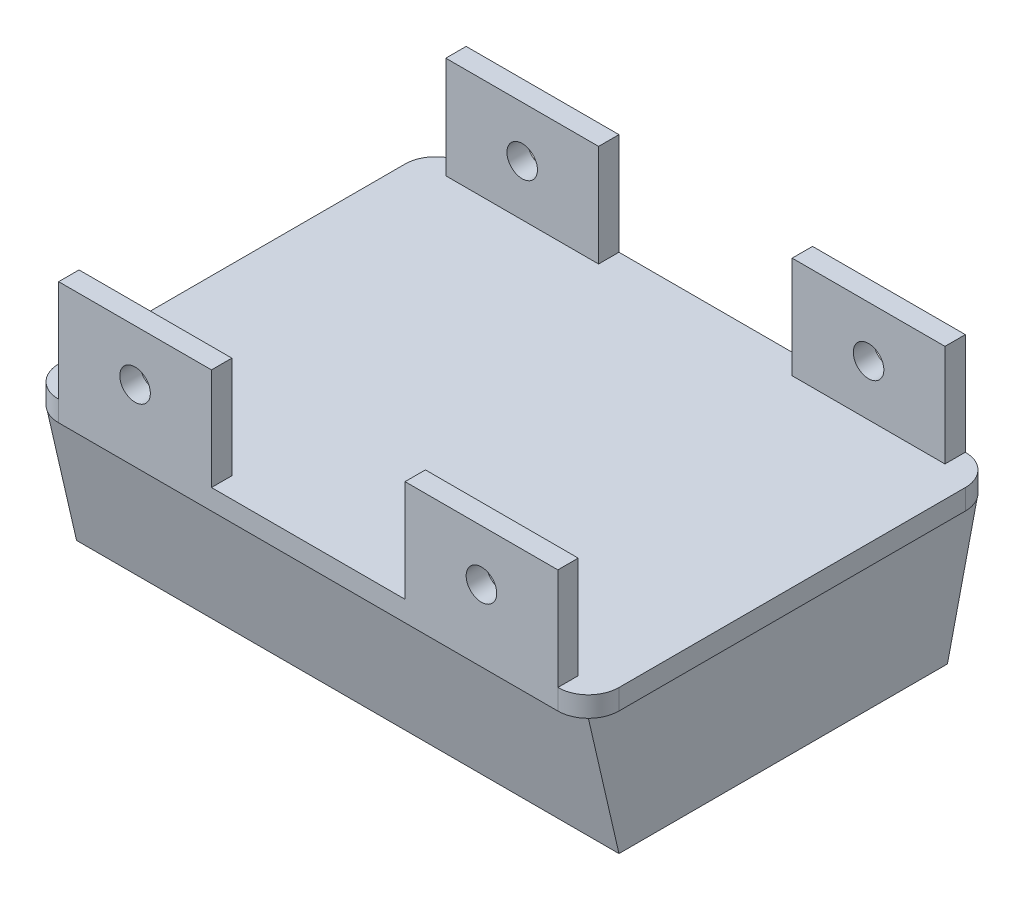
ISO-10303-21;
HEADER;
FILE_DESCRIPTION(('STEP AP214'),'2;1');
FILE_NAME('part.step','',(''),(''),'','','');
FILE_SCHEMA(('AUTOMOTIVE_DESIGN { 1 0 10303 214 1 1 1 1 }'));
ENDSEC;
DATA;
#1=APPLICATION_CONTEXT('core data for automotive mechanical design processes');
#2=APPLICATION_PROTOCOL_DEFINITION('international standard','automotive_design',2000,#1);
#3=PRODUCT_CONTEXT('',#1,'mechanical');
#4=PRODUCT('Part','Part','',(#3));
#5=PRODUCT_RELATED_PRODUCT_CATEGORY('part','',(#4));
#6=PRODUCT_DEFINITION_FORMATION('','',#4);
#7=PRODUCT_DEFINITION_CONTEXT('part definition',#1,'design');
#8=PRODUCT_DEFINITION('design','',#6,#7);
#9=PRODUCT_DEFINITION_SHAPE('','',#8);
#10=(LENGTH_UNIT() NAMED_UNIT(*) SI_UNIT(.MILLI.,.METRE.));
#11=(NAMED_UNIT(*) PLANE_ANGLE_UNIT() SI_UNIT($,.RADIAN.));
#12=(NAMED_UNIT(*) SI_UNIT($,.STERADIAN.) SOLID_ANGLE_UNIT());
#13=UNCERTAINTY_MEASURE_WITH_UNIT(LENGTH_MEASURE(1.E-05),#10,'distance_accuracy_value','');
#14=(GEOMETRIC_REPRESENTATION_CONTEXT(3) GLOBAL_UNCERTAINTY_ASSIGNED_CONTEXT((#13)) GLOBAL_UNIT_ASSIGNED_CONTEXT((#10,
#11,#12)) REPRESENTATION_CONTEXT('',''));
#15=CARTESIAN_POINT('',(0.,0.,0.));
#16=DIRECTION('',(0.,0.,1.));
#17=DIRECTION('',(1.,0.,0.));
#18=AXIS2_PLACEMENT_3D('',#15,#16,#17);
#19=CARTESIAN_POINT('',(8.81179653403585,-13.,22.752272724512));
#20=DIRECTION('',(1.,0.,0.));
#21=DIRECTION('',(0.,0.,-1.));
#22=AXIS2_PLACEMENT_3D('',#19,#20,#21);
#23=PLANE('',#22);
#24=DIRECTION('',(0.,-0.97439119569462,0.224859506698759));
#25=VECTOR('',#24,1.);
#26=CARTESIAN_POINT('',(8.81179653403585,-20.7217021730205,-10.7084366919102));
#27=LINE('',#26,#25);
#28=CARTESIAN_POINT('',(8.81179653403585,0.,-15.4903679626073));
#29=VERTEX_POINT('',#28);
#30=CARTESIAN_POINT('',(8.81179653403585,-13.,-12.4903679626073));
#31=VERTEX_POINT('',#30);
#32=EDGE_CURVE('E63',#29,#31,#27,.T.);
#33=ORIENTED_EDGE('',*,*,#32,.F.);
#34=DIRECTION('',(0.,0.,-1.));
#35=VECTOR('',#34,1.);
#36=CARTESIAN_POINT('',(8.81179653403585,0.,22.752272724512));
#37=LINE('',#36,#35);
#38=CARTESIAN_POINT('',(8.81179653403584,0.,22.752272724512));
#39=VERTEX_POINT('',#38);
#40=EDGE_CURVE('E238',#39,#29,#37,.T.);
#41=ORIENTED_EDGE('',*,*,#40,.F.);
#42=DIRECTION('',(0.,-0.97439119569462,-0.224859506698759));
#43=VECTOR('',#42,1.);
#44=CARTESIAN_POINT('',(8.81179653403585,-12.3426966292135,19.9039581177705));
#45=LINE('',#44,#43);
#46=CARTESIAN_POINT('',(8.81179653403585,-13.,19.752272724512));
#47=VERTEX_POINT('',#46);
#48=EDGE_CURVE('E219',#39,#47,#45,.T.);
#49=ORIENTED_EDGE('',*,*,#48,.T.);
#50=DIRECTION('',(0.,0.,-1.));
#51=VECTOR('',#50,1.);
#52=CARTESIAN_POINT('',(8.81179653403585,-13.,22.752272724512));
#53=LINE('',#52,#51);
#54=EDGE_CURVE('E227',#47,#31,#53,.T.);
#55=ORIENTED_EDGE('',*,*,#54,.T.);
#56=EDGE_LOOP('',(#33,#41,#49,#55));
#57=FACE_BOUND('',#56,.T.);
#58=ADVANCED_FACE('F40',(#57),#23,.T.);
#59=CARTESIAN_POINT('',(-44.4308441530834,-13.,22.752272724512));
#60=DIRECTION('',(1.,0.,0.));
#61=DIRECTION('',(0.,0.,-1.));
#62=AXIS2_PLACEMENT_3D('',#59,#60,#61);
#63=PLANE('',#62);
#64=DIRECTION('',(0.,0.,-1.));
#65=VECTOR('',#64,1.);
#66=CARTESIAN_POINT('',(-44.4308441530834,0.,22.752272724512));
#67=LINE('',#66,#65);
#68=CARTESIAN_POINT('',(-44.4308441530834,0.,22.752272724512));
#69=VERTEX_POINT('',#68);
#70=CARTESIAN_POINT('',(-44.4308441530834,0.,-15.4903679626073));
#71=VERTEX_POINT('',#70);
#72=EDGE_CURVE('E222',#69,#71,#67,.T.);
#73=ORIENTED_EDGE('',*,*,#72,.T.);
#74=DIRECTION('',(0.,0.97439119569462,-0.224859506698759));
#75=VECTOR('',#74,1.);
#76=CARTESIAN_POINT('',(-44.4308441530834,-13.,-12.4903679626073));
#77=LINE('',#76,#75);
#78=CARTESIAN_POINT('',(-44.4308441530834,-13.,-12.4903679626073));
#79=VERTEX_POINT('',#78);
#80=EDGE_CURVE('E211',#79,#71,#77,.T.);
#81=ORIENTED_EDGE('',*,*,#80,.F.);
#82=DIRECTION('',(0.,0.,-1.));
#83=VECTOR('',#82,1.);
#84=CARTESIAN_POINT('',(-44.4308441530834,-13.,22.752272724512));
#85=LINE('',#84,#83);
#86=CARTESIAN_POINT('',(-44.4308441530834,-13.,19.752272724512));
#87=VERTEX_POINT('',#86);
#88=EDGE_CURVE('E308',#87,#79,#85,.T.);
#89=ORIENTED_EDGE('',*,*,#88,.F.);
#90=DIRECTION('',(0.,0.97439119569462,0.224859506698759));
#91=VECTOR('',#90,1.);
#92=CARTESIAN_POINT('',(-44.4308441530834,-13.,19.752272724512));
#93=LINE('',#92,#91);
#94=EDGE_CURVE('E55',#87,#69,#93,.T.);
#95=ORIENTED_EDGE('',*,*,#94,.T.);
#96=EDGE_LOOP('',(#73,#81,#89,#95));
#97=FACE_BOUND('',#96,.T.);
#98=ADVANCED_FACE('F223',(#97),#63,.F.);
#99=CARTESIAN_POINT('',(0.,-13.,0.));
#100=DIRECTION('',(0.,1.,0.));
#101=DIRECTION('',(0.,0.,1.));
#102=AXIS2_PLACEMENT_3D('',#99,#100,#101);
#103=PLANE('',#102);
#104=CARTESIAN_POINT('',(-17.8095238095238,-13.,3.63095238095238));
#105=DIRECTION('',(0.,1.,0.));
#106=DIRECTION('',(0.,0.,1.));
#107=AXIS2_PLACEMENT_3D('',#104,#105,#106);
#108=CIRCLE('',#107,0.750000000000002);
#109=CARTESIAN_POINT('',(-17.8095238095238,-13.,4.38095238095238));
#110=VERTEX_POINT('',#109);
#111=EDGE_CURVE('E11',#110,#110,#108,.F.);
#112=ORIENTED_EDGE('',*,*,#111,.F.);
#113=EDGE_LOOP('',(#112));
#114=FACE_BOUND('',#113,.T.);
#115=ORIENTED_EDGE('',*,*,#88,.T.);
#116=DIRECTION('',(1.,0.,0.));
#117=VECTOR('',#116,1.);
#118=CARTESIAN_POINT('',(0.,-13.,-12.4903679626073));
#119=LINE('',#118,#117);
#120=EDGE_CURVE('E48',#79,#31,#119,.T.);
#121=ORIENTED_EDGE('',*,*,#120,.T.);
#122=ORIENTED_EDGE('',*,*,#54,.F.);
#123=DIRECTION('',(1.,0.,0.));
#124=VECTOR('',#123,1.);
#125=CARTESIAN_POINT('',(0.,-13.,19.752272724512));
#126=LINE('',#125,#124);
#127=EDGE_CURVE('E293',#87,#47,#126,.T.);
#128=ORIENTED_EDGE('',*,*,#127,.F.);
#129=EDGE_LOOP('',(#115,#121,#122,#128));
#130=FACE_BOUND('',#129,.T.);
#131=ADVANCED_FACE('F307',(#114,#130),#103,.F.);
#132=CARTESIAN_POINT('',(0.,0.,0.));
#133=DIRECTION('',(0.,1.,0.));
#134=DIRECTION('',(0.,0.,1.));
#135=AXIS2_PLACEMENT_3D('',#132,#133,#134);
#136=PLANE('',#135);
#137=DIRECTION('',(1.,0.,0.));
#138=VECTOR('',#137,1.);
#139=CARTESIAN_POINT('',(-44.4308441530834,0.,-15.4903679626073));
#140=LINE('',#139,#138);
#141=EDGE_CURVE('E215',#71,#29,#140,.T.);
#142=ORIENTED_EDGE('',*,*,#141,.F.);
#143=CARTESIAN_POINT('',(-42.3095238095238,0.,-13.3690476190476));
#144=DIRECTION('',(0.,1.,0.));
#145=DIRECTION('',(0.,0.,1.));
#146=AXIS2_PLACEMENT_3D('',#143,#144,#145);
#147=CIRCLE('',#146,3.);
#148=CARTESIAN_POINT('',(-42.3095238095238,0.,-16.3690476190476));
#149=VERTEX_POINT('',#148);
#150=EDGE_CURVE('E235',#71,#149,#147,.F.);
#151=ORIENTED_EDGE('',*,*,#150,.T.);
#152=DIRECTION('',(-1.,0.,0.));
#153=VECTOR('',#152,1.);
#154=CARTESIAN_POINT('',(-45.3095238095238,0.,-16.3690476190476));
#155=LINE('',#154,#153);
#156=CARTESIAN_POINT('',(6.6904761904762,0.,-16.3690476190476));
#157=VERTEX_POINT('',#156);
#158=EDGE_CURVE('E457',#157,#149,#155,.T.);
#159=ORIENTED_EDGE('',*,*,#158,.F.);
#160=CARTESIAN_POINT('',(6.6904761904762,0.,-13.3690476190476));
#161=DIRECTION('',(0.,1.,0.));
#162=DIRECTION('',(0.,0.,1.));
#163=AXIS2_PLACEMENT_3D('',#160,#161,#162);
#164=CIRCLE('',#163,3.);
#165=EDGE_CURVE('E237',#157,#29,#164,.F.);
#166=ORIENTED_EDGE('',*,*,#165,.T.);
#167=EDGE_LOOP('',(#142,#151,#159,#166));
#168=FACE_BOUND('',#167,.T.);
#169=ADVANCED_FACE('F233',(#168),#136,.F.);
#170=ORIENTED_EDGE('',*,*,#72,.F.);
#171=CARTESIAN_POINT('',(-42.3095238095238,0.,20.6309523809524));
#172=DIRECTION('',(0.,1.,0.));
#173=DIRECTION('',(0.,0.,1.));
#174=AXIS2_PLACEMENT_3D('',#171,#172,#173);
#175=CIRCLE('',#174,3.);
#176=CARTESIAN_POINT('',(-45.3095238095238,0.,20.6309523809524));
#177=VERTEX_POINT('',#176);
#178=EDGE_CURVE('E265',#69,#177,#175,.F.);
#179=ORIENTED_EDGE('',*,*,#178,.T.);
#180=DIRECTION('',(0.,0.,1.));
#181=VECTOR('',#180,1.);
#182=CARTESIAN_POINT('',(-45.3095238095238,0.,-16.3690476190476));
#183=LINE('',#182,#181);
#184=CARTESIAN_POINT('',(-45.3095238095238,0.,-13.3690476190476));
#185=VERTEX_POINT('',#184);
#186=EDGE_CURVE('E253',#185,#177,#183,.T.);
#187=ORIENTED_EDGE('',*,*,#186,.F.);
#188=EDGE_CURVE('E244',#185,#71,#147,.F.);
#189=ORIENTED_EDGE('',*,*,#188,.T.);
#190=EDGE_LOOP('',(#170,#179,#187,#189));
#191=FACE_BOUND('',#190,.T.);
#192=ADVANCED_FACE('F251',(#191),#136,.F.);
#193=CARTESIAN_POINT('',(-42.3095238095238,0.,23.6309523809524));
#194=VERTEX_POINT('',#193);
#195=EDGE_CURVE('E266',#194,#69,#175,.F.);
#196=ORIENTED_EDGE('',*,*,#195,.T.);
#197=DIRECTION('',(1.,0.,0.));
#198=VECTOR('',#197,1.);
#199=CARTESIAN_POINT('',(-44.4308441530834,0.,22.752272724512));
#200=LINE('',#199,#198);
#201=EDGE_CURVE('E228',#69,#39,#200,.T.);
#202=ORIENTED_EDGE('',*,*,#201,.T.);
#203=CARTESIAN_POINT('',(6.6904761904762,0.,20.6309523809524));
#204=DIRECTION('',(0.,1.,0.));
#205=DIRECTION('',(0.,0.,1.));
#206=AXIS2_PLACEMENT_3D('',#203,#204,#205);
#207=CIRCLE('',#206,3.);
#208=CARTESIAN_POINT('',(6.69047619047621,0.,23.6309523809524));
#209=VERTEX_POINT('',#208);
#210=EDGE_CURVE('E287',#39,#209,#207,.F.);
#211=ORIENTED_EDGE('',*,*,#210,.T.);
#212=DIRECTION('',(1.,0.,0.));
#213=VECTOR('',#212,1.);
#214=CARTESIAN_POINT('',(-45.3095238095238,0.,23.6309523809524));
#215=LINE('',#214,#213);
#216=EDGE_CURVE('E464',#194,#209,#215,.T.);
#217=ORIENTED_EDGE('',*,*,#216,.F.);
#218=EDGE_LOOP('',(#196,#202,#211,#217));
#219=FACE_BOUND('',#218,.T.);
#220=ADVANCED_FACE('F526',(#219),#136,.F.);
#221=CARTESIAN_POINT('',(6.6904761904762,2.,20.6309523809524));
#222=DIRECTION('',(0.,1.,0.));
#223=DIRECTION('',(0.,0.,1.));
#224=AXIS2_PLACEMENT_3D('',#221,#222,#223);
#225=CYLINDRICAL_SURFACE('',#224,3.);
#226=DIRECTION('',(0.,1.,0.));
#227=VECTOR('',#226,1.);
#228=CARTESIAN_POINT('',(6.6904761904762,2.,23.6309523809524));
#229=LINE('',#228,#227);
#230=CARTESIAN_POINT('',(6.6904761904762,2.,23.6309523809524));
#231=VERTEX_POINT('',#230);
#232=EDGE_CURVE('E281',#209,#231,#229,.T.);
#233=ORIENTED_EDGE('',*,*,#232,.F.);
#234=ORIENTED_EDGE('',*,*,#210,.F.);
#235=CARTESIAN_POINT('',(9.69047619047621,0.,20.6309523809524));
#236=VERTEX_POINT('',#235);
#237=EDGE_CURVE('E288',#236,#39,#207,.F.);
#238=ORIENTED_EDGE('',*,*,#237,.F.);
#239=DIRECTION('',(0.,1.,0.));
#240=VECTOR('',#239,1.);
#241=CARTESIAN_POINT('',(9.69047619047621,2.,20.6309523809524));
#242=LINE('',#241,#240);
#243=CARTESIAN_POINT('',(9.69047619047621,2.,20.6309523809524));
#244=VERTEX_POINT('',#243);
#245=EDGE_CURVE('E284',#244,#236,#242,.F.);
#246=ORIENTED_EDGE('',*,*,#245,.F.);
#247=CARTESIAN_POINT('',(6.6904761904762,2.,20.6309523809524));
#248=DIRECTION('',(0.,1.,0.));
#249=DIRECTION('',(0.,0.,1.));
#250=AXIS2_PLACEMENT_3D('',#247,#248,#249);
#251=CIRCLE('',#250,3.);
#252=EDGE_CURVE('E291',#231,#244,#251,.T.);
#253=ORIENTED_EDGE('',*,*,#252,.F.);
#254=EDGE_LOOP('',(#233,#234,#238,#246,#253));
#255=FACE_BOUND('',#254,.T.);
#256=ADVANCED_FACE('F42',(#255),#225,.T.);
#257=CARTESIAN_POINT('',(6.6904761904762,2.,-13.3690476190476));
#258=DIRECTION('',(0.,-1.,0.));
#259=DIRECTION('',(0.,0.,-1.));
#260=AXIS2_PLACEMENT_3D('',#257,#258,#259);
#261=CYLINDRICAL_SURFACE('',#260,3.);
#262=DIRECTION('',(0.,-1.,0.));
#263=VECTOR('',#262,1.);
#264=CARTESIAN_POINT('',(6.6904761904762,2.,-16.3690476190476));
#265=LINE('',#264,#263);
#266=CARTESIAN_POINT('',(6.6904761904762,2.,-16.3690476190476));
#267=VERTEX_POINT('',#266);
#268=EDGE_CURVE('E271',#267,#157,#265,.T.);
#269=ORIENTED_EDGE('',*,*,#268,.F.);
#270=CARTESIAN_POINT('',(6.6904761904762,2.,-13.3690476190476));
#271=DIRECTION('',(0.,1.,0.));
#272=DIRECTION('',(0.,0.,1.));
#273=AXIS2_PLACEMENT_3D('',#270,#271,#272);
#274=CIRCLE('',#273,3.);
#275=CARTESIAN_POINT('',(9.6904761904762,2.,-13.3690476190476));
#276=VERTEX_POINT('',#275);
#277=EDGE_CURVE('E277',#276,#267,#274,.T.);
#278=ORIENTED_EDGE('',*,*,#277,.F.);
#279=DIRECTION('',(0.,-1.,0.));
#280=VECTOR('',#279,1.);
#281=CARTESIAN_POINT('',(9.6904761904762,2.,-13.3690476190476));
#282=LINE('',#281,#280);
#283=CARTESIAN_POINT('',(9.6904761904762,0.,-13.3690476190476));
#284=VERTEX_POINT('',#283);
#285=EDGE_CURVE('E274',#284,#276,#282,.F.);
#286=ORIENTED_EDGE('',*,*,#285,.F.);
#287=EDGE_CURVE('E279',#29,#284,#164,.F.);
#288=ORIENTED_EDGE('',*,*,#287,.F.);
#289=ORIENTED_EDGE('',*,*,#165,.F.);
#290=EDGE_LOOP('',(#269,#278,#286,#288,#289));
#291=FACE_BOUND('',#290,.T.);
#292=ADVANCED_FACE('F511',(#291),#261,.T.);
#293=CARTESIAN_POINT('',(-42.3095238095238,2.,20.6309523809524));
#294=DIRECTION('',(0.,1.,0.));
#295=DIRECTION('',(0.,0.,1.));
#296=AXIS2_PLACEMENT_3D('',#293,#294,#295);
#297=CYLINDRICAL_SURFACE('',#296,3.);
#298=DIRECTION('',(0.,1.,0.));
#299=VECTOR('',#298,1.);
#300=CARTESIAN_POINT('',(-45.3095238095238,2.,20.6309523809524));
#301=LINE('',#300,#299);
#302=CARTESIAN_POINT('',(-45.3095238095238,2.,20.6309523809524));
#303=VERTEX_POINT('',#302);
#304=EDGE_CURVE('E255',#177,#303,#301,.T.);
#305=ORIENTED_EDGE('',*,*,#304,.F.);
#306=ORIENTED_EDGE('',*,*,#178,.F.);
#307=ORIENTED_EDGE('',*,*,#195,.F.);
#308=DIRECTION('',(0.,1.,0.));
#309=VECTOR('',#308,1.);
#310=CARTESIAN_POINT('',(-42.3095238095238,2.,23.6309523809524));
#311=LINE('',#310,#309);
#312=CARTESIAN_POINT('',(-42.3095238095238,2.,23.6309523809524));
#313=VERTEX_POINT('',#312);
#314=EDGE_CURVE('E262',#313,#194,#311,.F.);
#315=ORIENTED_EDGE('',*,*,#314,.F.);
#316=CARTESIAN_POINT('',(-42.3095238095238,2.,20.6309523809524));
#317=DIRECTION('',(0.,1.,0.));
#318=DIRECTION('',(0.,0.,1.));
#319=AXIS2_PLACEMENT_3D('',#316,#317,#318);
#320=CIRCLE('',#319,3.);
#321=EDGE_CURVE('E269',#303,#313,#320,.T.);
#322=ORIENTED_EDGE('',*,*,#321,.F.);
#323=EDGE_LOOP('',(#305,#306,#307,#315,#322));
#324=FACE_BOUND('',#323,.T.);
#325=ADVANCED_FACE('F634',(#324),#297,.T.);
#326=CARTESIAN_POINT('',(-42.3095238095238,2.,-13.3690476190476));
#327=DIRECTION('',(0.,1.,0.));
#328=DIRECTION('',(0.,0.,1.));
#329=AXIS2_PLACEMENT_3D('',#326,#327,#328);
#330=CYLINDRICAL_SURFACE('',#329,3.);
#331=DIRECTION('',(0.,1.,0.));
#332=VECTOR('',#331,1.);
#333=CARTESIAN_POINT('',(-42.3095238095238,2.,-16.3690476190476));
#334=LINE('',#333,#332);
#335=CARTESIAN_POINT('',(-42.3095238095238,2.,-16.3690476190476));
#336=VERTEX_POINT('',#335);
#337=EDGE_CURVE('E247',#149,#336,#334,.T.);
#338=ORIENTED_EDGE('',*,*,#337,.F.);
#339=ORIENTED_EDGE('',*,*,#150,.F.);
#340=ORIENTED_EDGE('',*,*,#188,.F.);
#341=DIRECTION('',(0.,1.,0.));
#342=VECTOR('',#341,1.);
#343=CARTESIAN_POINT('',(-45.3095238095238,2.,-13.3690476190476));
#344=LINE('',#343,#342);
#345=CARTESIAN_POINT('',(-45.3095238095238,2.,-13.3690476190476));
#346=VERTEX_POINT('',#345);
#347=EDGE_CURVE('E248',#346,#185,#344,.F.);
#348=ORIENTED_EDGE('',*,*,#347,.F.);
#349=CARTESIAN_POINT('',(-42.3095238095238,2.,-13.3690476190476));
#350=DIRECTION('',(0.,1.,0.));
#351=DIRECTION('',(0.,0.,1.));
#352=AXIS2_PLACEMENT_3D('',#349,#350,#351);
#353=CIRCLE('',#352,3.);
#354=EDGE_CURVE('E254',#336,#346,#353,.T.);
#355=ORIENTED_EDGE('',*,*,#354,.F.);
#356=EDGE_LOOP('',(#338,#339,#340,#348,#355));
#357=FACE_BOUND('',#356,.T.);
#358=ADVANCED_FACE('F242',(#357),#330,.T.);
#359=CARTESIAN_POINT('',(0.,2.,0.));
#360=DIRECTION('',(0.,1.,0.));
#361=DIRECTION('',(0.,0.,1.));
#362=AXIS2_PLACEMENT_3D('',#359,#360,#361);
#363=PLANE('',#362);
#364=DIRECTION('',(0.,0.,-1.));
#365=VECTOR('',#364,1.);
#366=CARTESIAN_POINT('',(6.6904761904762,2.,0.));
#367=LINE('',#366,#365);
#368=CARTESIAN_POINT('',(6.6904761904762,2.,21.6309523809524));
#369=VERTEX_POINT('',#368);
#370=EDGE_CURVE('E364',#231,#369,#367,.T.);
#371=ORIENTED_EDGE('',*,*,#370,.F.);
#372=ORIENTED_EDGE('',*,*,#252,.T.);
#373=DIRECTION('',(0.,0.,-1.));
#374=VECTOR('',#373,1.);
#375=CARTESIAN_POINT('',(9.6904761904762,2.,-16.3690476190476));
#376=LINE('',#375,#374);
#377=EDGE_CURVE('E459',#244,#276,#376,.T.);
#378=ORIENTED_EDGE('',*,*,#377,.T.);
#379=ORIENTED_EDGE('',*,*,#277,.T.);
#380=DIRECTION('',(0.,0.,1.));
#381=VECTOR('',#380,1.);
#382=CARTESIAN_POINT('',(6.6904761904762,2.,0.));
#383=LINE('',#382,#381);
#384=CARTESIAN_POINT('',(6.6904761904762,2.,-14.3690476190476));
#385=VERTEX_POINT('',#384);
#386=EDGE_CURVE('E335',#267,#385,#383,.T.);
#387=ORIENTED_EDGE('',*,*,#386,.T.);
#388=DIRECTION('',(-1.,0.,0.));
#389=VECTOR('',#388,1.);
#390=CARTESIAN_POINT('',(0.,2.,-14.3690476190476));
#391=LINE('',#390,#389);
#392=CARTESIAN_POINT('',(-8.30952380952379,2.,-14.3690476190476));
#393=VERTEX_POINT('',#392);
#394=EDGE_CURVE('E340',#385,#393,#391,.T.);
#395=ORIENTED_EDGE('',*,*,#394,.T.);
#396=DIRECTION('',(0.,0.,1.));
#397=VECTOR('',#396,1.);
#398=CARTESIAN_POINT('',(-8.30952380952379,2.,0.));
#399=LINE('',#398,#397);
#400=CARTESIAN_POINT('',(-8.30952380952379,2.,-16.3690476190476));
#401=VERTEX_POINT('',#400);
#402=EDGE_CURVE('E349',#401,#393,#399,.T.);
#403=ORIENTED_EDGE('',*,*,#402,.F.);
#404=DIRECTION('',(-1.,0.,0.));
#405=VECTOR('',#404,1.);
#406=CARTESIAN_POINT('',(-45.3095238095238,2.,-16.3690476190476));
#407=LINE('',#406,#405);
#408=CARTESIAN_POINT('',(-27.3095238095238,2.,-16.3690476190476));
#409=VERTEX_POINT('',#408);
#410=EDGE_CURVE('E461',#401,#409,#407,.T.);
#411=ORIENTED_EDGE('',*,*,#410,.T.);
#412=DIRECTION('',(0.,0.,1.));
#413=VECTOR('',#412,1.);
#414=CARTESIAN_POINT('',(-27.3095238095238,2.,0.));
#415=LINE('',#414,#413);
#416=CARTESIAN_POINT('',(-27.3095238095238,2.,-14.3690476190476));
#417=VERTEX_POINT('',#416);
#418=EDGE_CURVE('E424',#409,#417,#415,.T.);
#419=ORIENTED_EDGE('',*,*,#418,.T.);
#420=DIRECTION('',(1.,0.,0.));
#421=VECTOR('',#420,1.);
#422=CARTESIAN_POINT('',(0.,2.,-14.3690476190476));
#423=LINE('',#422,#421);
#424=CARTESIAN_POINT('',(-42.3095238095238,2.,-14.3690476190476));
#425=VERTEX_POINT('',#424);
#426=EDGE_CURVE('E429',#425,#417,#423,.T.);
#427=ORIENTED_EDGE('',*,*,#426,.F.);
#428=DIRECTION('',(0.,0.,1.));
#429=VECTOR('',#428,1.);
#430=CARTESIAN_POINT('',(-42.3095238095238,2.,0.));
#431=LINE('',#430,#429);
#432=EDGE_CURVE('E437',#336,#425,#431,.T.);
#433=ORIENTED_EDGE('',*,*,#432,.F.);
#434=ORIENTED_EDGE('',*,*,#354,.T.);
#435=DIRECTION('',(0.,0.,1.));
#436=VECTOR('',#435,1.);
#437=CARTESIAN_POINT('',(-45.3095238095238,2.,-16.3690476190476));
#438=LINE('',#437,#436);
#439=EDGE_CURVE('E453',#346,#303,#438,.T.);
#440=ORIENTED_EDGE('',*,*,#439,.T.);
#441=ORIENTED_EDGE('',*,*,#321,.T.);
#442=DIRECTION('',(0.,0.,1.));
#443=VECTOR('',#442,1.);
#444=CARTESIAN_POINT('',(-42.3095238095238,2.,0.));
#445=LINE('',#444,#443);
#446=CARTESIAN_POINT('',(-42.3095238095238,2.,21.6309523809524));
#447=VERTEX_POINT('',#446);
#448=EDGE_CURVE('E399',#447,#313,#445,.T.);
#449=ORIENTED_EDGE('',*,*,#448,.F.);
#450=DIRECTION('',(1.,0.,0.));
#451=VECTOR('',#450,1.);
#452=CARTESIAN_POINT('',(0.,2.,21.6309523809524));
#453=LINE('',#452,#451);
#454=CARTESIAN_POINT('',(-27.3095238095238,2.,21.6309523809524));
#455=VERTEX_POINT('',#454);
#456=EDGE_CURVE('E409',#447,#455,#453,.T.);
#457=ORIENTED_EDGE('',*,*,#456,.T.);
#458=DIRECTION('',(0.,0.,-1.));
#459=VECTOR('',#458,1.);
#460=CARTESIAN_POINT('',(-27.3095238095238,2.,0.));
#461=LINE('',#460,#459);
#462=CARTESIAN_POINT('',(-27.3095238095238,2.,23.6309523809524));
#463=VERTEX_POINT('',#462);
#464=EDGE_CURVE('E394',#463,#455,#461,.T.);
#465=ORIENTED_EDGE('',*,*,#464,.F.);
#466=DIRECTION('',(1.,0.,0.));
#467=VECTOR('',#466,1.);
#468=CARTESIAN_POINT('',(-45.3095238095238,2.,23.6309523809524));
#469=LINE('',#468,#467);
#470=CARTESIAN_POINT('',(-8.30952380952379,2.,23.6309523809524));
#471=VERTEX_POINT('',#470);
#472=EDGE_CURVE('E456',#463,#471,#469,.T.);
#473=ORIENTED_EDGE('',*,*,#472,.T.);
#474=DIRECTION('',(0.,0.,-1.));
#475=VECTOR('',#474,1.);
#476=CARTESIAN_POINT('',(-8.30952380952379,2.,0.));
#477=LINE('',#476,#475);
#478=CARTESIAN_POINT('',(-8.30952380952379,2.,21.6309523809524));
#479=VERTEX_POINT('',#478);
#480=EDGE_CURVE('E369',#471,#479,#477,.T.);
#481=ORIENTED_EDGE('',*,*,#480,.T.);
#482=DIRECTION('',(-1.,0.,0.));
#483=VECTOR('',#482,1.);
#484=CARTESIAN_POINT('',(0.,2.,21.6309523809524));
#485=LINE('',#484,#483);
#486=EDGE_CURVE('E379',#369,#479,#485,.T.);
#487=ORIENTED_EDGE('',*,*,#486,.F.);
#488=EDGE_LOOP('',(#371,#372,#378,#379,#387,#395,#403,#411,#419,#427,#433,#434,#440,#441,#449,
#457,#465,#473,#481,#487));
#489=FACE_BOUND('',#488,.T.);
#490=ADVANCED_FACE('F478',(#489),#363,.T.);
#491=CARTESIAN_POINT('',(-45.3095238095238,2.,-16.3690476190476));
#492=DIRECTION('',(1.,0.,0.));
#493=DIRECTION('',(0.,0.,-1.));
#494=AXIS2_PLACEMENT_3D('',#491,#492,#493);
#495=PLANE('',#494);
#496=ORIENTED_EDGE('',*,*,#186,.T.);
#497=ORIENTED_EDGE('',*,*,#304,.T.);
#498=ORIENTED_EDGE('',*,*,#439,.F.);
#499=ORIENTED_EDGE('',*,*,#347,.T.);
#500=EDGE_LOOP('',(#496,#497,#498,#499));
#501=FACE_BOUND('',#500,.T.);
#502=ADVANCED_FACE('F475',(#501),#495,.F.);
#503=CARTESIAN_POINT('',(-45.3095238095238,2.,23.6309523809524));
#504=DIRECTION('',(0.,0.,-1.));
#505=DIRECTION('',(-1.,0.,0.));
#506=AXIS2_PLACEMENT_3D('',#503,#504,#505);
#507=PLANE('',#506);
#508=CARTESIAN_POINT('',(-0.809523809523798,7.,23.6309523809524));
#509=DIRECTION('',(0.,0.,1.));
#510=DIRECTION('',(1.,0.,0.));
#511=AXIS2_PLACEMENT_3D('',#508,#509,#510);
#512=CIRCLE('',#511,1.5);
#513=CARTESIAN_POINT('',(0.690476190476202,7.,23.6309523809524));
#514=VERTEX_POINT('',#513);
#515=EDGE_CURVE('E298',#514,#514,#512,.T.);
#516=ORIENTED_EDGE('',*,*,#515,.F.);
#517=EDGE_LOOP('',(#516));
#518=FACE_BOUND('',#517,.T.);
#519=CARTESIAN_POINT('',(-34.8095238095238,7.,23.6309523809524));
#520=DIRECTION('',(0.,0.,1.));
#521=DIRECTION('',(1.,0.,0.));
#522=AXIS2_PLACEMENT_3D('',#519,#520,#521);
#523=CIRCLE('',#522,1.5);
#524=CARTESIAN_POINT('',(-33.3095238095238,7.,23.6309523809524));
#525=VERTEX_POINT('',#524);
#526=EDGE_CURVE('E314',#525,#525,#523,.T.);
#527=ORIENTED_EDGE('',*,*,#526,.F.);
#528=EDGE_LOOP('',(#527));
#529=FACE_BOUND('',#528,.T.);
#530=ORIENTED_EDGE('',*,*,#216,.T.);
#531=ORIENTED_EDGE('',*,*,#232,.T.);
#532=DIRECTION('',(0.,-1.,0.));
#533=VECTOR('',#532,1.);
#534=CARTESIAN_POINT('',(6.6904761904762,12.,23.6309523809524));
#535=LINE('',#534,#533);
#536=CARTESIAN_POINT('',(6.6904761904762,12.,23.6309523809524));
#537=VERTEX_POINT('',#536);
#538=EDGE_CURVE('E391',#537,#231,#535,.T.);
#539=ORIENTED_EDGE('',*,*,#538,.F.);
#540=DIRECTION('',(1.,0.,0.));
#541=VECTOR('',#540,1.);
#542=CARTESIAN_POINT('',(0.,12.,23.6309523809524));
#543=LINE('',#542,#541);
#544=CARTESIAN_POINT('',(-8.30952380952379,12.,23.6309523809524));
#545=VERTEX_POINT('',#544);
#546=EDGE_CURVE('E365',#545,#537,#543,.T.);
#547=ORIENTED_EDGE('',*,*,#546,.F.);
#548=DIRECTION('',(0.,-1.,0.));
#549=VECTOR('',#548,1.);
#550=CARTESIAN_POINT('',(-8.30952380952379,12.,23.6309523809524));
#551=LINE('',#550,#549);
#552=EDGE_CURVE('E376',#545,#471,#551,.T.);
#553=ORIENTED_EDGE('',*,*,#552,.T.);
#554=ORIENTED_EDGE('',*,*,#472,.F.);
#555=DIRECTION('',(0.,-1.,0.));
#556=VECTOR('',#555,1.);
#557=CARTESIAN_POINT('',(-27.3095238095238,12.,23.6309523809524));
#558=LINE('',#557,#556);
#559=CARTESIAN_POINT('',(-27.3095238095238,12.,23.6309523809524));
#560=VERTEX_POINT('',#559);
#561=EDGE_CURVE('E421',#560,#463,#558,.T.);
#562=ORIENTED_EDGE('',*,*,#561,.F.);
#563=DIRECTION('',(1.,0.,0.));
#564=VECTOR('',#563,1.);
#565=CARTESIAN_POINT('',(0.,12.,23.6309523809524));
#566=LINE('',#565,#564);
#567=CARTESIAN_POINT('',(-42.3095238095238,12.,23.6309523809524));
#568=VERTEX_POINT('',#567);
#569=EDGE_CURVE('E395',#568,#560,#566,.T.);
#570=ORIENTED_EDGE('',*,*,#569,.F.);
#571=DIRECTION('',(0.,-1.,0.));
#572=VECTOR('',#571,1.);
#573=CARTESIAN_POINT('',(-42.3095238095238,12.,23.6309523809524));
#574=LINE('',#573,#572);
#575=EDGE_CURVE('E406',#568,#313,#574,.T.);
#576=ORIENTED_EDGE('',*,*,#575,.T.);
#577=ORIENTED_EDGE('',*,*,#314,.T.);
#578=EDGE_LOOP('',(#530,#531,#539,#547,#553,#554,#562,#570,#576,#577));
#579=FACE_BOUND('',#578,.T.);
#580=ADVANCED_FACE('F626',(#518,#529,#579),#507,.F.);
#581=CARTESIAN_POINT('',(9.6904761904762,2.,-16.3690476190476));
#582=DIRECTION('',(-1.,0.,0.));
#583=DIRECTION('',(0.,0.,1.));
#584=AXIS2_PLACEMENT_3D('',#581,#582,#583);
#585=PLANE('',#584);
#586=ORIENTED_EDGE('',*,*,#377,.F.);
#587=ORIENTED_EDGE('',*,*,#245,.T.);
#588=DIRECTION('',(0.,0.,-1.));
#589=VECTOR('',#588,1.);
#590=CARTESIAN_POINT('',(9.6904761904762,0.,-16.3690476190476));
#591=LINE('',#590,#589);
#592=EDGE_CURVE('E467',#236,#284,#591,.T.);
#593=ORIENTED_EDGE('',*,*,#592,.T.);
#594=ORIENTED_EDGE('',*,*,#285,.T.);
#595=EDGE_LOOP('',(#586,#587,#593,#594));
#596=FACE_BOUND('',#595,.T.);
#597=ADVANCED_FACE('F519',(#596),#585,.F.);
#598=CARTESIAN_POINT('',(-45.3095238095238,2.,-16.3690476190476));
#599=DIRECTION('',(0.,0.,1.));
#600=DIRECTION('',(1.,0.,0.));
#601=AXIS2_PLACEMENT_3D('',#598,#599,#600);
#602=PLANE('',#601);
#603=CARTESIAN_POINT('',(-0.809523809523798,7.,-16.3690476190476));
#604=DIRECTION('',(0.,0.,1.));
#605=DIRECTION('',(1.,0.,0.));
#606=AXIS2_PLACEMENT_3D('',#603,#604,#605);
#607=CIRCLE('',#606,1.5);
#608=CARTESIAN_POINT('',(0.690476190476202,7.,-16.3690476190476));
#609=VERTEX_POINT('',#608);
#610=EDGE_CURVE('E303',#609,#609,#607,.T.);
#611=ORIENTED_EDGE('',*,*,#610,.T.);
#612=EDGE_LOOP('',(#611));
#613=FACE_BOUND('',#612,.T.);
#614=CARTESIAN_POINT('',(-34.8095238095238,7.,-16.3690476190476));
#615=DIRECTION('',(0.,0.,1.));
#616=DIRECTION('',(1.,0.,0.));
#617=AXIS2_PLACEMENT_3D('',#614,#615,#616);
#618=CIRCLE('',#617,1.5);
#619=CARTESIAN_POINT('',(-33.3095238095238,7.,-16.3690476190476));
#620=VERTEX_POINT('',#619);
#621=EDGE_CURVE('E332',#620,#620,#618,.T.);
#622=ORIENTED_EDGE('',*,*,#621,.T.);
#623=EDGE_LOOP('',(#622));
#624=FACE_BOUND('',#623,.T.);
#625=DIRECTION('',(0.,-1.,0.));
#626=VECTOR('',#625,1.);
#627=CARTESIAN_POINT('',(6.6904761904762,12.,-16.3690476190476));
#628=LINE('',#627,#626);
#629=CARTESIAN_POINT('',(6.6904761904762,12.,-16.3690476190476));
#630=VERTEX_POINT('',#629);
#631=EDGE_CURVE('E361',#630,#267,#628,.T.);
#632=ORIENTED_EDGE('',*,*,#631,.T.);
#633=ORIENTED_EDGE('',*,*,#268,.T.);
#634=ORIENTED_EDGE('',*,*,#158,.T.);
#635=ORIENTED_EDGE('',*,*,#337,.T.);
#636=DIRECTION('',(0.,-1.,0.));
#637=VECTOR('',#636,1.);
#638=CARTESIAN_POINT('',(-42.3095238095238,12.,-16.3690476190476));
#639=LINE('',#638,#637);
#640=CARTESIAN_POINT('',(-42.3095238095238,12.,-16.3690476190476));
#641=VERTEX_POINT('',#640);
#642=EDGE_CURVE('E447',#641,#336,#639,.T.);
#643=ORIENTED_EDGE('',*,*,#642,.F.);
#644=DIRECTION('',(-1.,0.,0.));
#645=VECTOR('',#644,1.);
#646=CARTESIAN_POINT('',(0.,12.,-16.3690476190476));
#647=LINE('',#646,#645);
#648=CARTESIAN_POINT('',(-27.3095238095238,12.,-16.3690476190476));
#649=VERTEX_POINT('',#648);
#650=EDGE_CURVE('E428',#649,#641,#647,.T.);
#651=ORIENTED_EDGE('',*,*,#650,.F.);
#652=DIRECTION('',(0.,-1.,0.));
#653=VECTOR('',#652,1.);
#654=CARTESIAN_POINT('',(-27.3095238095238,12.,-16.3690476190476));
#655=LINE('',#654,#653);
#656=EDGE_CURVE('E450',#649,#409,#655,.T.);
#657=ORIENTED_EDGE('',*,*,#656,.T.);
#658=ORIENTED_EDGE('',*,*,#410,.F.);
#659=DIRECTION('',(0.,-1.,0.));
#660=VECTOR('',#659,1.);
#661=CARTESIAN_POINT('',(-8.30952380952379,12.,-16.3690476190476));
#662=LINE('',#661,#660);
#663=CARTESIAN_POINT('',(-8.30952380952379,12.,-16.3690476190476));
#664=VERTEX_POINT('',#663);
#665=EDGE_CURVE('E358',#664,#401,#662,.T.);
#666=ORIENTED_EDGE('',*,*,#665,.F.);
#667=DIRECTION('',(-1.,0.,0.));
#668=VECTOR('',#667,1.);
#669=CARTESIAN_POINT('',(0.,12.,-16.3690476190476));
#670=LINE('',#669,#668);
#671=EDGE_CURVE('E339',#630,#664,#670,.T.);
#672=ORIENTED_EDGE('',*,*,#671,.F.);
#673=EDGE_LOOP('',(#632,#633,#634,#635,#643,#651,#657,#658,#666,#672));
#674=FACE_BOUND('',#673,.T.);
#675=ADVANCED_FACE('F484',(#613,#624,#674),#602,.F.);
#676=ORIENTED_EDGE('',*,*,#237,.T.);
#677=ORIENTED_EDGE('',*,*,#40,.T.);
#678=ORIENTED_EDGE('',*,*,#287,.T.);
#679=ORIENTED_EDGE('',*,*,#592,.F.);
#680=EDGE_LOOP('',(#676,#677,#678,#679));
#681=FACE_BOUND('',#680,.T.);
#682=ADVANCED_FACE('F516',(#681),#136,.F.);
#683=CARTESIAN_POINT('',(-27.3095238095238,12.,0.));
#684=DIRECTION('',(1.,0.,0.));
#685=DIRECTION('',(0.,0.,-1.));
#686=AXIS2_PLACEMENT_3D('',#683,#684,#685);
#687=PLANE('',#686);
#688=ORIENTED_EDGE('',*,*,#418,.F.);
#689=ORIENTED_EDGE('',*,*,#656,.F.);
#690=DIRECTION('',(0.,0.,1.));
#691=VECTOR('',#690,1.);
#692=CARTESIAN_POINT('',(-27.3095238095238,12.,0.));
#693=LINE('',#692,#691);
#694=CARTESIAN_POINT('',(-27.3095238095238,12.,-14.3690476190476));
#695=VERTEX_POINT('',#694);
#696=EDGE_CURVE('E425',#649,#695,#693,.T.);
#697=ORIENTED_EDGE('',*,*,#696,.T.);
#698=DIRECTION('',(0.,-1.,0.));
#699=VECTOR('',#698,1.);
#700=CARTESIAN_POINT('',(-27.3095238095238,12.,-14.3690476190476));
#701=LINE('',#700,#699);
#702=EDGE_CURVE('E435',#695,#417,#701,.T.);
#703=ORIENTED_EDGE('',*,*,#702,.T.);
#704=EDGE_LOOP('',(#688,#689,#697,#703));
#705=FACE_BOUND('',#704,.T.);
#706=ADVANCED_FACE('F492',(#705),#687,.T.);
#707=CARTESIAN_POINT('',(-42.3095238095238,12.,0.));
#708=DIRECTION('',(1.,0.,0.));
#709=DIRECTION('',(0.,0.,-1.));
#710=AXIS2_PLACEMENT_3D('',#707,#708,#709);
#711=PLANE('',#710);
#712=ORIENTED_EDGE('',*,*,#432,.T.);
#713=DIRECTION('',(0.,-1.,0.));
#714=VECTOR('',#713,1.);
#715=CARTESIAN_POINT('',(-42.3095238095238,12.,-14.3690476190476));
#716=LINE('',#715,#714);
#717=CARTESIAN_POINT('',(-42.3095238095238,12.,-14.3690476190476));
#718=VERTEX_POINT('',#717);
#719=EDGE_CURVE('E444',#718,#425,#716,.T.);
#720=ORIENTED_EDGE('',*,*,#719,.F.);
#721=DIRECTION('',(0.,0.,1.));
#722=VECTOR('',#721,1.);
#723=CARTESIAN_POINT('',(-42.3095238095238,12.,0.));
#724=LINE('',#723,#722);
#725=EDGE_CURVE('E431',#641,#718,#724,.T.);
#726=ORIENTED_EDGE('',*,*,#725,.F.);
#727=ORIENTED_EDGE('',*,*,#642,.T.);
#728=EDGE_LOOP('',(#712,#720,#726,#727));
#729=FACE_BOUND('',#728,.T.);
#730=ADVANCED_FACE('F482',(#729),#711,.F.);
#731=CARTESIAN_POINT('',(0.,12.,-14.3690476190476));
#732=DIRECTION('',(0.,0.,-1.));
#733=DIRECTION('',(-1.,0.,0.));
#734=AXIS2_PLACEMENT_3D('',#731,#732,#733);
#735=PLANE('',#734);
#736=CARTESIAN_POINT('',(-34.8095238095238,7.,-14.3690476190476));
#737=DIRECTION('',(0.,0.,-1.));
#738=DIRECTION('',(-1.,0.,0.));
#739=AXIS2_PLACEMENT_3D('',#736,#737,#738);
#740=CIRCLE('',#739,1.5);
#741=CARTESIAN_POINT('',(-36.3095238095238,7.,-14.3690476190476));
#742=VERTEX_POINT('',#741);
#743=EDGE_CURVE('E302',#742,#742,#740,.T.);
#744=ORIENTED_EDGE('',*,*,#743,.T.);
#745=EDGE_LOOP('',(#744));
#746=FACE_BOUND('',#745,.T.);
#747=ORIENTED_EDGE('',*,*,#426,.T.);
#748=ORIENTED_EDGE('',*,*,#702,.F.);
#749=DIRECTION('',(1.,0.,0.));
#750=VECTOR('',#749,1.);
#751=CARTESIAN_POINT('',(0.,12.,-14.3690476190476));
#752=LINE('',#751,#750);
#753=EDGE_CURVE('E433',#718,#695,#752,.T.);
#754=ORIENTED_EDGE('',*,*,#753,.F.);
#755=ORIENTED_EDGE('',*,*,#719,.T.);
#756=EDGE_LOOP('',(#747,#748,#754,#755));
#757=FACE_BOUND('',#756,.T.);
#758=ADVANCED_FACE('F610',(#746,#757),#735,.F.);
#759=CARTESIAN_POINT('',(0.,12.,0.));
#760=DIRECTION('',(0.,1.,0.));
#761=DIRECTION('',(0.,0.,1.));
#762=AXIS2_PLACEMENT_3D('',#759,#760,#761);
#763=PLANE('',#762);
#764=ORIENTED_EDGE('',*,*,#696,.F.);
#765=ORIENTED_EDGE('',*,*,#650,.T.);
#766=ORIENTED_EDGE('',*,*,#725,.T.);
#767=ORIENTED_EDGE('',*,*,#753,.T.);
#768=EDGE_LOOP('',(#764,#765,#766,#767));
#769=FACE_BOUND('',#768,.T.);
#770=ADVANCED_FACE('F488',(#769),#763,.T.);
#771=CARTESIAN_POINT('',(-27.3095238095238,12.,0.));
#772=DIRECTION('',(-1.,0.,0.));
#773=DIRECTION('',(0.,0.,1.));
#774=AXIS2_PLACEMENT_3D('',#771,#772,#773);
#775=PLANE('',#774);
#776=ORIENTED_EDGE('',*,*,#464,.T.);
#777=DIRECTION('',(0.,-1.,0.));
#778=VECTOR('',#777,1.);
#779=CARTESIAN_POINT('',(-27.3095238095238,12.,21.6309523809524));
#780=LINE('',#779,#778);
#781=CARTESIAN_POINT('',(-27.3095238095238,12.,21.6309523809524));
#782=VERTEX_POINT('',#781);
#783=EDGE_CURVE('E418',#782,#455,#780,.T.);
#784=ORIENTED_EDGE('',*,*,#783,.F.);
#785=DIRECTION('',(0.,0.,-1.));
#786=VECTOR('',#785,1.);
#787=CARTESIAN_POINT('',(-27.3095238095238,12.,0.));
#788=LINE('',#787,#786);
#789=EDGE_CURVE('E398',#560,#782,#788,.T.);
#790=ORIENTED_EDGE('',*,*,#789,.F.);
#791=ORIENTED_EDGE('',*,*,#561,.T.);
#792=EDGE_LOOP('',(#776,#784,#790,#791));
#793=FACE_BOUND('',#792,.T.);
#794=ADVANCED_FACE('F603',(#793),#775,.F.);
#795=CARTESIAN_POINT('',(0.,12.,21.6309523809524));
#796=DIRECTION('',(0.,0.,-1.));
#797=DIRECTION('',(-1.,0.,0.));
#798=AXIS2_PLACEMENT_3D('',#795,#796,#797);
#799=PLANE('',#798);
#800=CARTESIAN_POINT('',(-34.8095238095238,7.,21.6309523809524));
#801=DIRECTION('',(0.,0.,-1.));
#802=DIRECTION('',(-1.,0.,0.));
#803=AXIS2_PLACEMENT_3D('',#800,#801,#802);
#804=CIRCLE('',#803,1.5);
#805=CARTESIAN_POINT('',(-36.3095238095238,7.,21.6309523809524));
#806=VERTEX_POINT('',#805);
#807=EDGE_CURVE('E299',#806,#806,#804,.T.);
#808=ORIENTED_EDGE('',*,*,#807,.F.);
#809=EDGE_LOOP('',(#808));
#810=FACE_BOUND('',#809,.T.);
#811=ORIENTED_EDGE('',*,*,#456,.F.);
#812=DIRECTION('',(0.,-1.,0.));
#813=VECTOR('',#812,1.);
#814=CARTESIAN_POINT('',(-42.3095238095238,12.,21.6309523809524));
#815=LINE('',#814,#813);
#816=CARTESIAN_POINT('',(-42.3095238095238,12.,21.6309523809524));
#817=VERTEX_POINT('',#816);
#818=EDGE_CURVE('E415',#817,#447,#815,.T.);
#819=ORIENTED_EDGE('',*,*,#818,.F.);
#820=DIRECTION('',(1.,0.,0.));
#821=VECTOR('',#820,1.);
#822=CARTESIAN_POINT('',(0.,12.,21.6309523809524));
#823=LINE('',#822,#821);
#824=EDGE_CURVE('E401',#817,#782,#823,.T.);
#825=ORIENTED_EDGE('',*,*,#824,.T.);
#826=ORIENTED_EDGE('',*,*,#783,.T.);
#827=EDGE_LOOP('',(#811,#819,#825,#826));
#828=FACE_BOUND('',#827,.T.);
#829=ADVANCED_FACE('F599',(#810,#828),#799,.T.);
#830=CARTESIAN_POINT('',(-42.3095238095238,12.,0.));
#831=DIRECTION('',(1.,0.,0.));
#832=DIRECTION('',(0.,0.,-1.));
#833=AXIS2_PLACEMENT_3D('',#830,#831,#832);
#834=PLANE('',#833);
#835=ORIENTED_EDGE('',*,*,#448,.T.);
#836=ORIENTED_EDGE('',*,*,#575,.F.);
#837=DIRECTION('',(0.,0.,1.));
#838=VECTOR('',#837,1.);
#839=CARTESIAN_POINT('',(-42.3095238095238,12.,0.));
#840=LINE('',#839,#838);
#841=EDGE_CURVE('E404',#817,#568,#840,.T.);
#842=ORIENTED_EDGE('',*,*,#841,.F.);
#843=ORIENTED_EDGE('',*,*,#818,.T.);
#844=EDGE_LOOP('',(#835,#836,#842,#843));
#845=FACE_BOUND('',#844,.T.);
#846=ADVANCED_FACE('F595',(#845),#834,.F.);
#847=CARTESIAN_POINT('',(0.,12.,0.));
#848=DIRECTION('',(0.,1.,0.));
#849=DIRECTION('',(0.,0.,1.));
#850=AXIS2_PLACEMENT_3D('',#847,#848,#849);
#851=PLANE('',#850);
#852=ORIENTED_EDGE('',*,*,#569,.T.);
#853=ORIENTED_EDGE('',*,*,#789,.T.);
#854=ORIENTED_EDGE('',*,*,#824,.F.);
#855=ORIENTED_EDGE('',*,*,#841,.T.);
#856=EDGE_LOOP('',(#852,#853,#854,#855));
#857=FACE_BOUND('',#856,.T.);
#858=ADVANCED_FACE('F591',(#857),#851,.T.);
#859=CARTESIAN_POINT('',(6.6904761904762,12.,0.));
#860=DIRECTION('',(-1.,0.,0.));
#861=DIRECTION('',(0.,0.,1.));
#862=AXIS2_PLACEMENT_3D('',#859,#860,#861);
#863=PLANE('',#862);
#864=ORIENTED_EDGE('',*,*,#370,.T.);
#865=DIRECTION('',(0.,-1.,0.));
#866=VECTOR('',#865,1.);
#867=CARTESIAN_POINT('',(6.6904761904762,12.,21.6309523809524));
#868=LINE('',#867,#866);
#869=CARTESIAN_POINT('',(6.6904761904762,12.,21.6309523809524));
#870=VERTEX_POINT('',#869);
#871=EDGE_CURVE('E388',#870,#369,#868,.T.);
#872=ORIENTED_EDGE('',*,*,#871,.F.);
#873=DIRECTION('',(0.,0.,-1.));
#874=VECTOR('',#873,1.);
#875=CARTESIAN_POINT('',(6.6904761904762,12.,0.));
#876=LINE('',#875,#874);
#877=EDGE_CURVE('E368',#537,#870,#876,.T.);
#878=ORIENTED_EDGE('',*,*,#877,.F.);
#879=ORIENTED_EDGE('',*,*,#538,.T.);
#880=EDGE_LOOP('',(#864,#872,#878,#879));
#881=FACE_BOUND('',#880,.T.);
#882=ADVANCED_FACE('F587',(#881),#863,.F.);
#883=CARTESIAN_POINT('',(0.,12.,21.6309523809524));
#884=DIRECTION('',(0.,0.,1.));
#885=DIRECTION('',(1.,0.,0.));
#886=AXIS2_PLACEMENT_3D('',#883,#884,#885);
#887=PLANE('',#886);
#888=CARTESIAN_POINT('',(-0.809523809523798,7.,21.6309523809524));
#889=DIRECTION('',(0.,0.,1.));
#890=DIRECTION('',(1.,0.,0.));
#891=AXIS2_PLACEMENT_3D('',#888,#889,#890);
#892=CIRCLE('',#891,1.5);
#893=CARTESIAN_POINT('',(0.690476190476202,7.,21.6309523809524));
#894=VERTEX_POINT('',#893);
#895=EDGE_CURVE('E297',#894,#894,#892,.T.);
#896=ORIENTED_EDGE('',*,*,#895,.T.);
#897=EDGE_LOOP('',(#896));
#898=FACE_BOUND('',#897,.T.);
#899=ORIENTED_EDGE('',*,*,#486,.T.);
#900=DIRECTION('',(0.,-1.,0.));
#901=VECTOR('',#900,1.);
#902=CARTESIAN_POINT('',(-8.30952380952379,12.,21.6309523809524));
#903=LINE('',#902,#901);
#904=CARTESIAN_POINT('',(-8.30952380952379,12.,21.6309523809524));
#905=VERTEX_POINT('',#904);
#906=EDGE_CURVE('E385',#905,#479,#903,.T.);
#907=ORIENTED_EDGE('',*,*,#906,.F.);
#908=DIRECTION('',(-1.,0.,0.));
#909=VECTOR('',#908,1.);
#910=CARTESIAN_POINT('',(0.,12.,21.6309523809524));
#911=LINE('',#910,#909);
#912=EDGE_CURVE('E371',#870,#905,#911,.T.);
#913=ORIENTED_EDGE('',*,*,#912,.F.);
#914=ORIENTED_EDGE('',*,*,#871,.T.);
#915=EDGE_LOOP('',(#899,#907,#913,#914));
#916=FACE_BOUND('',#915,.T.);
#917=ADVANCED_FACE('F583',(#898,#916),#887,.F.);
#918=CARTESIAN_POINT('',(-8.30952380952379,12.,0.));
#919=DIRECTION('',(-1.,0.,0.));
#920=DIRECTION('',(0.,0.,1.));
#921=AXIS2_PLACEMENT_3D('',#918,#919,#920);
#922=PLANE('',#921);
#923=ORIENTED_EDGE('',*,*,#480,.F.);
#924=ORIENTED_EDGE('',*,*,#552,.F.);
#925=DIRECTION('',(0.,0.,-1.));
#926=VECTOR('',#925,1.);
#927=CARTESIAN_POINT('',(-8.30952380952379,12.,0.));
#928=LINE('',#927,#926);
#929=EDGE_CURVE('E373',#545,#905,#928,.T.);
#930=ORIENTED_EDGE('',*,*,#929,.T.);
#931=ORIENTED_EDGE('',*,*,#906,.T.);
#932=EDGE_LOOP('',(#923,#924,#930,#931));
#933=FACE_BOUND('',#932,.T.);
#934=ADVANCED_FACE('F579',(#933),#922,.T.);
#935=CARTESIAN_POINT('',(0.,12.,0.));
#936=DIRECTION('',(0.,1.,0.));
#937=DIRECTION('',(0.,0.,1.));
#938=AXIS2_PLACEMENT_3D('',#935,#936,#937);
#939=PLANE('',#938);
#940=ORIENTED_EDGE('',*,*,#546,.T.);
#941=ORIENTED_EDGE('',*,*,#877,.T.);
#942=ORIENTED_EDGE('',*,*,#912,.T.);
#943=ORIENTED_EDGE('',*,*,#929,.F.);
#944=EDGE_LOOP('',(#940,#941,#942,#943));
#945=FACE_BOUND('',#944,.T.);
#946=ADVANCED_FACE('F576',(#945),#939,.T.);
#947=CARTESIAN_POINT('',(6.6904761904762,12.,0.));
#948=DIRECTION('',(1.,0.,0.));
#949=DIRECTION('',(0.,0.,-1.));
#950=AXIS2_PLACEMENT_3D('',#947,#948,#949);
#951=PLANE('',#950);
#952=ORIENTED_EDGE('',*,*,#386,.F.);
#953=ORIENTED_EDGE('',*,*,#631,.F.);
#954=DIRECTION('',(0.,0.,1.));
#955=VECTOR('',#954,1.);
#956=CARTESIAN_POINT('',(6.6904761904762,12.,0.));
#957=LINE('',#956,#955);
#958=CARTESIAN_POINT('',(6.6904761904762,12.,-14.3690476190476));
#959=VERTEX_POINT('',#958);
#960=EDGE_CURVE('E336',#630,#959,#957,.T.);
#961=ORIENTED_EDGE('',*,*,#960,.T.);
#962=DIRECTION('',(0.,-1.,0.));
#963=VECTOR('',#962,1.);
#964=CARTESIAN_POINT('',(6.6904761904762,12.,-14.3690476190476));
#965=LINE('',#964,#963);
#966=EDGE_CURVE('E347',#959,#385,#965,.T.);
#967=ORIENTED_EDGE('',*,*,#966,.T.);
#968=EDGE_LOOP('',(#952,#953,#961,#967));
#969=FACE_BOUND('',#968,.T.);
#970=ADVANCED_FACE('F506',(#969),#951,.T.);
#971=CARTESIAN_POINT('',(-8.30952380952379,12.,0.));
#972=DIRECTION('',(1.,0.,0.));
#973=DIRECTION('',(0.,0.,-1.));
#974=AXIS2_PLACEMENT_3D('',#971,#972,#973);
#975=PLANE('',#974);
#976=ORIENTED_EDGE('',*,*,#402,.T.);
#977=DIRECTION('',(0.,-1.,0.));
#978=VECTOR('',#977,1.);
#979=CARTESIAN_POINT('',(-8.30952380952379,12.,-14.3690476190476));
#980=LINE('',#979,#978);
#981=CARTESIAN_POINT('',(-8.30952380952379,12.,-14.3690476190476));
#982=VERTEX_POINT('',#981);
#983=EDGE_CURVE('E355',#982,#393,#980,.T.);
#984=ORIENTED_EDGE('',*,*,#983,.F.);
#985=DIRECTION('',(0.,0.,1.));
#986=VECTOR('',#985,1.);
#987=CARTESIAN_POINT('',(-8.30952380952379,12.,0.));
#988=LINE('',#987,#986);
#989=EDGE_CURVE('E342',#664,#982,#988,.T.);
#990=ORIENTED_EDGE('',*,*,#989,.F.);
#991=ORIENTED_EDGE('',*,*,#665,.T.);
#992=EDGE_LOOP('',(#976,#984,#990,#991));
#993=FACE_BOUND('',#992,.T.);
#994=ADVANCED_FACE('F500',(#993),#975,.F.);
#995=CARTESIAN_POINT('',(0.,12.,-14.3690476190476));
#996=DIRECTION('',(0.,0.,1.));
#997=DIRECTION('',(1.,0.,0.));
#998=AXIS2_PLACEMENT_3D('',#995,#996,#997);
#999=PLANE('',#998);
#1000=CARTESIAN_POINT('',(-0.809523809523798,7.,-14.3690476190476));
#1001=DIRECTION('',(0.,0.,1.));
#1002=DIRECTION('',(1.,0.,0.));
#1003=AXIS2_PLACEMENT_3D('',#1000,#1001,#1002);
#1004=CIRCLE('',#1003,1.5);
#1005=CARTESIAN_POINT('',(0.690476190476202,7.,-14.3690476190476));
#1006=VERTEX_POINT('',#1005);
#1007=EDGE_CURVE('E294',#1006,#1006,#1004,.T.);
#1008=ORIENTED_EDGE('',*,*,#1007,.F.);
#1009=EDGE_LOOP('',(#1008));
#1010=FACE_BOUND('',#1009,.T.);
#1011=ORIENTED_EDGE('',*,*,#394,.F.);
#1012=ORIENTED_EDGE('',*,*,#966,.F.);
#1013=DIRECTION('',(-1.,0.,0.));
#1014=VECTOR('',#1013,1.);
#1015=CARTESIAN_POINT('',(0.,12.,-14.3690476190476));
#1016=LINE('',#1015,#1014);
#1017=EDGE_CURVE('E344',#959,#982,#1016,.T.);
#1018=ORIENTED_EDGE('',*,*,#1017,.T.);
#1019=ORIENTED_EDGE('',*,*,#983,.T.);
#1020=EDGE_LOOP('',(#1011,#1012,#1018,#1019));
#1021=FACE_BOUND('',#1020,.T.);
#1022=ADVANCED_FACE('F568',(#1010,#1021),#999,.T.);
#1023=CARTESIAN_POINT('',(0.,12.,0.));
#1024=DIRECTION('',(0.,1.,0.));
#1025=DIRECTION('',(0.,0.,1.));
#1026=AXIS2_PLACEMENT_3D('',#1023,#1024,#1025);
#1027=PLANE('',#1026);
#1028=ORIENTED_EDGE('',*,*,#960,.F.);
#1029=ORIENTED_EDGE('',*,*,#671,.T.);
#1030=ORIENTED_EDGE('',*,*,#989,.T.);
#1031=ORIENTED_EDGE('',*,*,#1017,.F.);
#1032=EDGE_LOOP('',(#1028,#1029,#1030,#1031));
#1033=FACE_BOUND('',#1032,.T.);
#1034=ADVANCED_FACE('F503',(#1033),#1027,.T.);
#1035=CARTESIAN_POINT('',(-0.809523809523798,7.,-26.3690476190476));
#1036=DIRECTION('',(0.,0.,1.));
#1037=DIRECTION('',(1.,0.,0.));
#1038=AXIS2_PLACEMENT_3D('',#1035,#1036,#1037);
#1039=CYLINDRICAL_SURFACE('',#1038,1.5);
#1040=ORIENTED_EDGE('',*,*,#1007,.T.);
#1041=EDGE_LOOP('',(#1040));
#1042=FACE_BOUND('',#1041,.T.);
#1043=ORIENTED_EDGE('',*,*,#610,.F.);
#1044=EDGE_LOOP('',(#1043));
#1045=FACE_BOUND('',#1044,.T.);
#1046=ADVANCED_FACE('F556',(#1042,#1045),#1039,.F.);
#1047=ORIENTED_EDGE('',*,*,#515,.T.);
#1048=EDGE_LOOP('',(#1047));
#1049=FACE_BOUND('',#1048,.T.);
#1050=ORIENTED_EDGE('',*,*,#895,.F.);
#1051=EDGE_LOOP('',(#1050));
#1052=FACE_BOUND('',#1051,.T.);
#1053=ADVANCED_FACE('F559',(#1049,#1052),#1039,.F.);
#1054=CARTESIAN_POINT('',(-34.8095238095238,7.,-26.3690476190476));
#1055=DIRECTION('',(0.,0.,1.));
#1056=DIRECTION('',(1.,0.,0.));
#1057=AXIS2_PLACEMENT_3D('',#1054,#1055,#1056);
#1058=CYLINDRICAL_SURFACE('',#1057,1.5);
#1059=ORIENTED_EDGE('',*,*,#807,.T.);
#1060=EDGE_LOOP('',(#1059));
#1061=FACE_BOUND('',#1060,.T.);
#1062=ORIENTED_EDGE('',*,*,#526,.T.);
#1063=EDGE_LOOP('',(#1062));
#1064=FACE_BOUND('',#1063,.T.);
#1065=ADVANCED_FACE('F561',(#1061,#1064),#1058,.F.);
#1066=ORIENTED_EDGE('',*,*,#743,.F.);
#1067=EDGE_LOOP('',(#1066));
#1068=FACE_BOUND('',#1067,.T.);
#1069=ORIENTED_EDGE('',*,*,#621,.F.);
#1070=EDGE_LOOP('',(#1069));
#1071=FACE_BOUND('',#1070,.T.);
#1072=ADVANCED_FACE('F564',(#1068,#1071),#1058,.F.);
#1073=CARTESIAN_POINT('',(9.69047619047621,-13.,19.752272724512));
#1074=DIRECTION('',(0.,-0.224859506698759,0.97439119569462));
#1075=DIRECTION('',(0.,-0.97439119569462,-0.224859506698759));
#1076=AXIS2_PLACEMENT_3D('',#1073,#1074,#1075);
#1077=PLANE('',#1076);
#1078=ORIENTED_EDGE('',*,*,#201,.F.);
#1079=ORIENTED_EDGE('',*,*,#94,.F.);
#1080=ORIENTED_EDGE('',*,*,#127,.T.);
#1081=ORIENTED_EDGE('',*,*,#48,.F.);
#1082=EDGE_LOOP('',(#1078,#1079,#1080,#1081));
#1083=FACE_BOUND('',#1082,.T.);
#1084=ADVANCED_FACE('F527',(#1083),#1077,.T.);
#1085=CARTESIAN_POINT('',(9.69047619047621,-13.,-12.4903679626073));
#1086=DIRECTION('',(0.,0.224859506698759,0.97439119569462));
#1087=DIRECTION('',(0.,-0.97439119569462,0.224859506698759));
#1088=AXIS2_PLACEMENT_3D('',#1085,#1086,#1087);
#1089=PLANE('',#1088);
#1090=ORIENTED_EDGE('',*,*,#32,.T.);
#1091=ORIENTED_EDGE('',*,*,#120,.F.);
#1092=ORIENTED_EDGE('',*,*,#80,.T.);
#1093=ORIENTED_EDGE('',*,*,#141,.T.);
#1094=EDGE_LOOP('',(#1090,#1091,#1092,#1093));
#1095=FACE_BOUND('',#1094,.T.);
#1096=ADVANCED_FACE('F213',(#1095),#1089,.F.);
#1097=CARTESIAN_POINT('',(-17.8095238095238,-17.,3.63095238095238));
#1098=DIRECTION('',(0.,1.,0.));
#1099=DIRECTION('',(0.,0.,1.));
#1100=AXIS2_PLACEMENT_3D('',#1097,#1098,#1099);
#1101=CYLINDRICAL_SURFACE('',#1100,0.750000000000002);
#1102=CARTESIAN_POINT('',(-17.8095238095238,-17.,3.63095238095238));
#1103=DIRECTION('',(0.,-1.,0.));
#1104=DIRECTION('',(0.,0.,-1.));
#1105=AXIS2_PLACEMENT_3D('',#1102,#1103,#1104);
#1106=CIRCLE('',#1105,0.750000000000002);
#1107=CARTESIAN_POINT('',(-17.8095238095238,-17.,2.88095238095238));
#1108=VERTEX_POINT('',#1107);
#1109=EDGE_CURVE('E529',#1108,#1108,#1106,.T.);
#1110=ORIENTED_EDGE('',*,*,#1109,.F.);
#1111=EDGE_LOOP('',(#1110));
#1112=FACE_BOUND('',#1111,.T.);
#1113=ORIENTED_EDGE('',*,*,#111,.T.);
#1114=EDGE_LOOP('',(#1113));
#1115=FACE_BOUND('',#1114,.T.);
#1116=ADVANCED_FACE('F536',(#1112,#1115),#1101,.T.);
#1117=CARTESIAN_POINT('',(-17.8095238095238,-17.,3.63095238095238));
#1118=DIRECTION('',(0.,-1.,0.));
#1119=DIRECTION('',(0.,0.,-1.));
#1120=AXIS2_PLACEMENT_3D('',#1117,#1118,#1119);
#1121=PLANE('',#1120);
#1122=ORIENTED_EDGE('',*,*,#1109,.T.);
#1123=EDGE_LOOP('',(#1122));
#1124=FACE_BOUND('',#1123,.T.);
#1125=ADVANCED_FACE('F534',(#1124),#1121,.T.);
#1126=CLOSED_SHELL('',(#58,#98,#131,#169,#192,#220,#256,#292,#325,#358,#490,#502,#580,#597,#675,
#682,#706,#730,#758,#770,#794,#829,#846,#858,#882,#917,#934,#946,#970,#994,#1022,#1034,#1046,
#1053,#1065,#1072,#1084,#1096,#1116,#1125));
#1127=MANIFOLD_SOLID_BREP('B2',#1126);
#1128=ADVANCED_BREP_SHAPE_REPRESENTATION('',(#18,#1127),#14);
#1129=SHAPE_DEFINITION_REPRESENTATION(#9,#1128);
ENDSEC;
END-ISO-10303-21;
